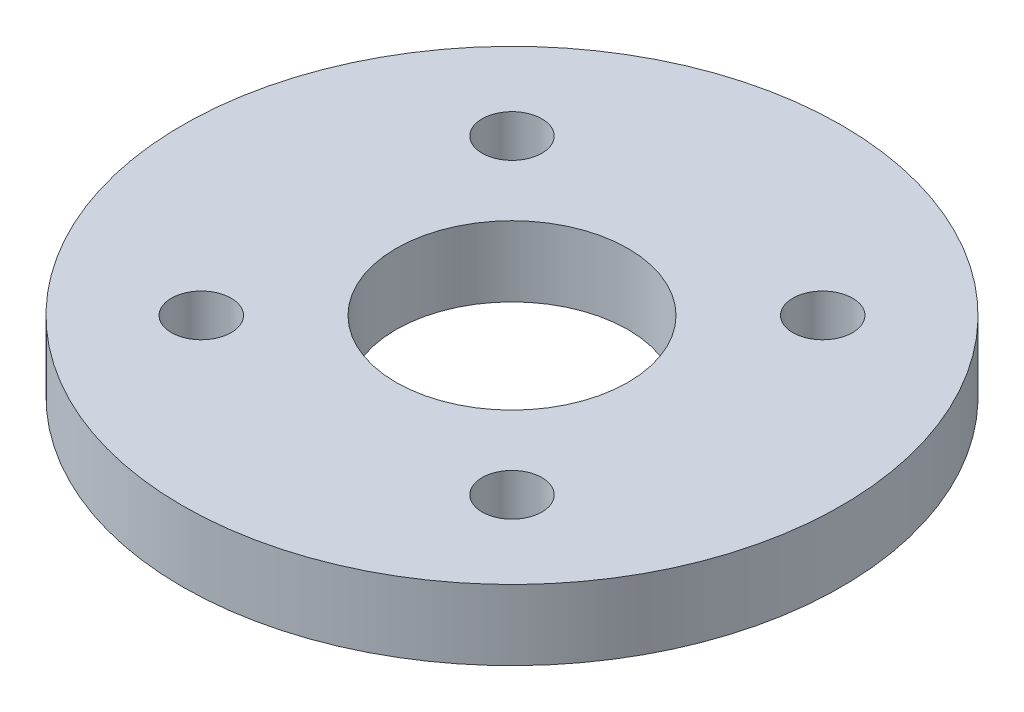
ISO-10303-21;
HEADER;
FILE_DESCRIPTION(('STEP AP214'),'2;1');
FILE_NAME('part.step','',(''),(''),'','','');
FILE_SCHEMA(('AUTOMOTIVE_DESIGN { 1 0 10303 214 1 1 1 1 }'));
ENDSEC;
DATA;
#1=APPLICATION_CONTEXT('core data for automotive mechanical design processes');
#2=APPLICATION_PROTOCOL_DEFINITION('international standard','automotive_design',2000,#1);
#3=PRODUCT_CONTEXT('',#1,'mechanical');
#4=PRODUCT('Part','Part','',(#3));
#5=PRODUCT_RELATED_PRODUCT_CATEGORY('part','',(#4));
#6=PRODUCT_DEFINITION_FORMATION('','',#4);
#7=PRODUCT_DEFINITION_CONTEXT('part definition',#1,'design');
#8=PRODUCT_DEFINITION('design','',#6,#7);
#9=PRODUCT_DEFINITION_SHAPE('','',#8);
#10=(LENGTH_UNIT() NAMED_UNIT(*) SI_UNIT(.MILLI.,.METRE.));
#11=(NAMED_UNIT(*) PLANE_ANGLE_UNIT() SI_UNIT($,.RADIAN.));
#12=(NAMED_UNIT(*) SI_UNIT($,.STERADIAN.) SOLID_ANGLE_UNIT());
#13=UNCERTAINTY_MEASURE_WITH_UNIT(LENGTH_MEASURE(1.E-05),#10,'distance_accuracy_value','');
#14=(GEOMETRIC_REPRESENTATION_CONTEXT(3) GLOBAL_UNCERTAINTY_ASSIGNED_CONTEXT((#13)) GLOBAL_UNIT_ASSIGNED_CONTEXT((#10,
#11,#12)) REPRESENTATION_CONTEXT('',''));
#15=CARTESIAN_POINT('',(0.,0.,0.));
#16=DIRECTION('',(0.,0.,1.));
#17=DIRECTION('',(1.,0.,0.));
#18=AXIS2_PLACEMENT_3D('',#15,#16,#17);
#19=CARTESIAN_POINT('',(-8.83883476483184,4.,-8.83883476483184));
#20=DIRECTION('',(0.,-1.,0.));
#21=DIRECTION('',(0.,0.,-1.));
#22=AXIS2_PLACEMENT_3D('',#19,#20,#21);
#23=CYLINDRICAL_SURFACE('',#22,1.7);
#24=CARTESIAN_POINT('',(-8.83883476483184,4.,-8.83883476483184));
#25=DIRECTION('',(0.,1.,0.));
#26=DIRECTION('',(0.,0.,1.));
#27=AXIS2_PLACEMENT_3D('',#24,#25,#26);
#28=CIRCLE('',#27,1.7);
#29=CARTESIAN_POINT('',(-8.83883476483184,4.,-7.13883476483184));
#30=VERTEX_POINT('',#29);
#31=EDGE_CURVE('E47',#30,#30,#28,.T.);
#32=ORIENTED_EDGE('',*,*,#31,.T.);
#33=EDGE_LOOP('',(#32));
#34=FACE_BOUND('',#33,.T.);
#35=CARTESIAN_POINT('',(-8.83883476483184,0.,-8.83883476483184));
#36=DIRECTION('',(0.,1.,0.));
#37=DIRECTION('',(0.,0.,1.));
#38=AXIS2_PLACEMENT_3D('',#35,#36,#37);
#39=CIRCLE('',#38,1.7);
#40=CARTESIAN_POINT('',(-8.83883476483184,0.,-7.13883476483184));
#41=VERTEX_POINT('',#40);
#42=EDGE_CURVE('E67',#41,#41,#39,.T.);
#43=ORIENTED_EDGE('',*,*,#42,.F.);
#44=EDGE_LOOP('',(#43));
#45=FACE_BOUND('',#44,.T.);
#46=ADVANCED_FACE('F39',(#34,#45),#23,.F.);
#47=CARTESIAN_POINT('',(-8.83883476483184,4.,8.83883476483185));
#48=DIRECTION('',(0.,-1.,0.));
#49=DIRECTION('',(0.,0.,-1.));
#50=AXIS2_PLACEMENT_3D('',#47,#48,#49);
#51=CYLINDRICAL_SURFACE('',#50,1.7);
#52=CARTESIAN_POINT('',(-8.83883476483184,4.,8.83883476483185));
#53=DIRECTION('',(0.,1.,0.));
#54=DIRECTION('',(0.,0.,1.));
#55=AXIS2_PLACEMENT_3D('',#52,#53,#54);
#56=CIRCLE('',#55,1.7);
#57=CARTESIAN_POINT('',(-8.83883476483184,4.,10.5388347648318));
#58=VERTEX_POINT('',#57);
#59=EDGE_CURVE('E52',#58,#58,#56,.T.);
#60=ORIENTED_EDGE('',*,*,#59,.T.);
#61=EDGE_LOOP('',(#60));
#62=FACE_BOUND('',#61,.T.);
#63=CARTESIAN_POINT('',(-8.83883476483184,0.,8.83883476483185));
#64=DIRECTION('',(0.,1.,0.));
#65=DIRECTION('',(0.,0.,1.));
#66=AXIS2_PLACEMENT_3D('',#63,#64,#65);
#67=CIRCLE('',#66,1.7);
#68=CARTESIAN_POINT('',(-8.83883476483184,0.,10.5388347648318));
#69=VERTEX_POINT('',#68);
#70=EDGE_CURVE('E65',#69,#69,#67,.T.);
#71=ORIENTED_EDGE('',*,*,#70,.F.);
#72=EDGE_LOOP('',(#71));
#73=FACE_BOUND('',#72,.T.);
#74=ADVANCED_FACE('F88',(#62,#73),#51,.F.);
#75=CARTESIAN_POINT('',(8.83883476483185,4.,8.83883476483184));
#76=DIRECTION('',(0.,-1.,0.));
#77=DIRECTION('',(0.,0.,-1.));
#78=AXIS2_PLACEMENT_3D('',#75,#76,#77);
#79=CYLINDRICAL_SURFACE('',#78,1.7);
#80=CARTESIAN_POINT('',(8.83883476483185,4.,8.83883476483184));
#81=DIRECTION('',(0.,1.,0.));
#82=DIRECTION('',(0.,0.,1.));
#83=AXIS2_PLACEMENT_3D('',#80,#81,#82);
#84=CIRCLE('',#83,1.7);
#85=CARTESIAN_POINT('',(8.83883476483185,4.,10.5388347648318));
#86=VERTEX_POINT('',#85);
#87=EDGE_CURVE('E81',#86,#86,#84,.T.);
#88=ORIENTED_EDGE('',*,*,#87,.T.);
#89=EDGE_LOOP('',(#88));
#90=FACE_BOUND('',#89,.T.);
#91=CARTESIAN_POINT('',(8.83883476483185,0.,8.83883476483184));
#92=DIRECTION('',(0.,1.,0.));
#93=DIRECTION('',(0.,0.,1.));
#94=AXIS2_PLACEMENT_3D('',#91,#92,#93);
#95=CIRCLE('',#94,1.7);
#96=CARTESIAN_POINT('',(8.83883476483185,0.,10.5388347648318));
#97=VERTEX_POINT('',#96);
#98=EDGE_CURVE('E62',#97,#97,#95,.T.);
#99=ORIENTED_EDGE('',*,*,#98,.F.);
#100=EDGE_LOOP('',(#99));
#101=FACE_BOUND('',#100,.T.);
#102=ADVANCED_FACE('F106',(#90,#101),#79,.F.);
#103=CARTESIAN_POINT('',(8.83883476483184,4.,-8.83883476483184));
#104=DIRECTION('',(0.,-1.,0.));
#105=DIRECTION('',(0.,0.,-1.));
#106=AXIS2_PLACEMENT_3D('',#103,#104,#105);
#107=CYLINDRICAL_SURFACE('',#106,1.7);
#108=CARTESIAN_POINT('',(8.83883476483184,4.,-8.83883476483184));
#109=DIRECTION('',(0.,1.,0.));
#110=DIRECTION('',(0.,0.,1.));
#111=AXIS2_PLACEMENT_3D('',#108,#109,#110);
#112=CIRCLE('',#111,1.7);
#113=CARTESIAN_POINT('',(8.83883476483184,4.,-7.13883476483185));
#114=VERTEX_POINT('',#113);
#115=EDGE_CURVE('E76',#114,#114,#112,.T.);
#116=ORIENTED_EDGE('',*,*,#115,.T.);
#117=EDGE_LOOP('',(#116));
#118=FACE_BOUND('',#117,.T.);
#119=CARTESIAN_POINT('',(8.83883476483184,0.,-8.83883476483184));
#120=DIRECTION('',(0.,1.,0.));
#121=DIRECTION('',(0.,0.,1.));
#122=AXIS2_PLACEMENT_3D('',#119,#120,#121);
#123=CIRCLE('',#122,1.7);
#124=CARTESIAN_POINT('',(8.83883476483184,0.,-7.13883476483185));
#125=VERTEX_POINT('',#124);
#126=EDGE_CURVE('E59',#125,#125,#123,.T.);
#127=ORIENTED_EDGE('',*,*,#126,.F.);
#128=EDGE_LOOP('',(#127));
#129=FACE_BOUND('',#128,.T.);
#130=ADVANCED_FACE('F112',(#118,#129),#107,.F.);
#131=CARTESIAN_POINT('',(0.,4.,0.));
#132=DIRECTION('',(0.,-1.,0.));
#133=DIRECTION('',(0.,0.,-1.));
#134=AXIS2_PLACEMENT_3D('',#131,#132,#133);
#135=CYLINDRICAL_SURFACE('',#134,6.6);
#136=CARTESIAN_POINT('',(0.,4.,0.));
#137=DIRECTION('',(0.,1.,0.));
#138=DIRECTION('',(0.,0.,1.));
#139=AXIS2_PLACEMENT_3D('',#136,#137,#138);
#140=CIRCLE('',#139,6.6);
#141=CARTESIAN_POINT('',(0.,4.,6.6));
#142=VERTEX_POINT('',#141);
#143=EDGE_CURVE('E72',#142,#142,#140,.T.);
#144=ORIENTED_EDGE('',*,*,#143,.T.);
#145=EDGE_LOOP('',(#144));
#146=FACE_BOUND('',#145,.T.);
#147=CARTESIAN_POINT('',(0.,0.,0.));
#148=DIRECTION('',(0.,1.,0.));
#149=DIRECTION('',(0.,0.,1.));
#150=AXIS2_PLACEMENT_3D('',#147,#148,#149);
#151=CIRCLE('',#150,6.6);
#152=CARTESIAN_POINT('',(0.,0.,6.6));
#153=VERTEX_POINT('',#152);
#154=EDGE_CURVE('E56',#153,#153,#151,.T.);
#155=ORIENTED_EDGE('',*,*,#154,.F.);
#156=EDGE_LOOP('',(#155));
#157=FACE_BOUND('',#156,.T.);
#158=ADVANCED_FACE('F41',(#146,#157),#135,.F.);
#159=CARTESIAN_POINT('',(0.,4.,0.));
#160=DIRECTION('',(0.,-1.,0.));
#161=DIRECTION('',(0.,0.,-1.));
#162=AXIS2_PLACEMENT_3D('',#159,#160,#161);
#163=CYLINDRICAL_SURFACE('',#162,18.75);
#164=CARTESIAN_POINT('',(0.,4.,0.));
#165=DIRECTION('',(0.,1.,0.));
#166=DIRECTION('',(0.,0.,1.));
#167=AXIS2_PLACEMENT_3D('',#164,#165,#166);
#168=CIRCLE('',#167,18.75);
#169=CARTESIAN_POINT('',(0.,4.,18.75));
#170=VERTEX_POINT('',#169);
#171=EDGE_CURVE('E10',#170,#170,#168,.T.);
#172=ORIENTED_EDGE('',*,*,#171,.F.);
#173=EDGE_LOOP('',(#172));
#174=FACE_BOUND('',#173,.T.);
#175=CARTESIAN_POINT('',(0.,0.,0.));
#176=DIRECTION('',(0.,1.,0.));
#177=DIRECTION('',(0.,0.,1.));
#178=AXIS2_PLACEMENT_3D('',#175,#176,#177);
#179=CIRCLE('',#178,18.75);
#180=CARTESIAN_POINT('',(0.,0.,18.75));
#181=VERTEX_POINT('',#180);
#182=EDGE_CURVE('E43',#181,#181,#179,.T.);
#183=ORIENTED_EDGE('',*,*,#182,.T.);
#184=EDGE_LOOP('',(#183));
#185=FACE_BOUND('',#184,.T.);
#186=ADVANCED_FACE('F95',(#174,#185),#163,.T.);
#187=CARTESIAN_POINT('',(0.,4.,0.));
#188=DIRECTION('',(0.,1.,0.));
#189=DIRECTION('',(0.,0.,1.));
#190=AXIS2_PLACEMENT_3D('',#187,#188,#189);
#191=PLANE('',#190);
#192=ORIENTED_EDGE('',*,*,#143,.F.);
#193=EDGE_LOOP('',(#192));
#194=FACE_BOUND('',#193,.T.);
#195=ORIENTED_EDGE('',*,*,#115,.F.);
#196=EDGE_LOOP('',(#195));
#197=FACE_BOUND('',#196,.T.);
#198=ORIENTED_EDGE('',*,*,#87,.F.);
#199=EDGE_LOOP('',(#198));
#200=FACE_BOUND('',#199,.T.);
#201=ORIENTED_EDGE('',*,*,#59,.F.);
#202=EDGE_LOOP('',(#201));
#203=FACE_BOUND('',#202,.T.);
#204=ORIENTED_EDGE('',*,*,#31,.F.);
#205=EDGE_LOOP('',(#204));
#206=FACE_BOUND('',#205,.T.);
#207=ORIENTED_EDGE('',*,*,#171,.T.);
#208=EDGE_LOOP('',(#207));
#209=FACE_BOUND('',#208,.T.);
#210=ADVANCED_FACE('F91',(#194,#197,#200,#203,#206,#209),#191,.T.);
#211=CARTESIAN_POINT('',(0.,0.,0.));
#212=DIRECTION('',(0.,1.,0.));
#213=DIRECTION('',(0.,0.,1.));
#214=AXIS2_PLACEMENT_3D('',#211,#212,#213);
#215=PLANE('',#214);
#216=ORIENTED_EDGE('',*,*,#154,.T.);
#217=EDGE_LOOP('',(#216));
#218=FACE_BOUND('',#217,.T.);
#219=ORIENTED_EDGE('',*,*,#126,.T.);
#220=EDGE_LOOP('',(#219));
#221=FACE_BOUND('',#220,.T.);
#222=ORIENTED_EDGE('',*,*,#98,.T.);
#223=EDGE_LOOP('',(#222));
#224=FACE_BOUND('',#223,.T.);
#225=ORIENTED_EDGE('',*,*,#70,.T.);
#226=EDGE_LOOP('',(#225));
#227=FACE_BOUND('',#226,.T.);
#228=ORIENTED_EDGE('',*,*,#42,.T.);
#229=EDGE_LOOP('',(#228));
#230=FACE_BOUND('',#229,.T.);
#231=ORIENTED_EDGE('',*,*,#182,.F.);
#232=EDGE_LOOP('',(#231));
#233=FACE_BOUND('',#232,.T.);
#234=ADVANCED_FACE('F94',(#218,#221,#224,#227,#230,#233),#215,.F.);
#235=CLOSED_SHELL('',(#46,#74,#102,#130,#158,#186,#210,#234));
#236=MANIFOLD_SOLID_BREP('B2',#235);
#237=ADVANCED_BREP_SHAPE_REPRESENTATION('',(#18,#236),#14);
#238=SHAPE_DEFINITION_REPRESENTATION(#9,#237);
ENDSEC;
END-ISO-10303-21;
